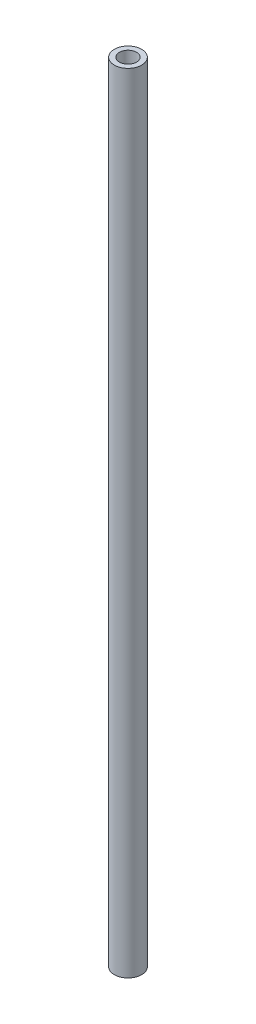
ISO-10303-21;
HEADER;
FILE_DESCRIPTION(('STEP AP214'),'2;1');
FILE_NAME('part.step','',(''),(''),'','','');
FILE_SCHEMA(('AUTOMOTIVE_DESIGN { 1 0 10303 214 1 1 1 1 }'));
ENDSEC;
DATA;
#1=APPLICATION_CONTEXT('core data for automotive mechanical design processes');
#2=APPLICATION_PROTOCOL_DEFINITION('international standard','automotive_design',2000,#1);
#3=PRODUCT_CONTEXT('',#1,'mechanical');
#4=PRODUCT('Part','Part','',(#3));
#5=PRODUCT_RELATED_PRODUCT_CATEGORY('part','',(#4));
#6=PRODUCT_DEFINITION_FORMATION('','',#4);
#7=PRODUCT_DEFINITION_CONTEXT('part definition',#1,'design');
#8=PRODUCT_DEFINITION('design','',#6,#7);
#9=PRODUCT_DEFINITION_SHAPE('','',#8);
#10=(LENGTH_UNIT() NAMED_UNIT(*) SI_UNIT(.MILLI.,.METRE.));
#11=(NAMED_UNIT(*) PLANE_ANGLE_UNIT() SI_UNIT($,.RADIAN.));
#12=(NAMED_UNIT(*) SI_UNIT($,.STERADIAN.) SOLID_ANGLE_UNIT());
#13=UNCERTAINTY_MEASURE_WITH_UNIT(LENGTH_MEASURE(1.E-05),#10,'distance_accuracy_value','');
#14=(GEOMETRIC_REPRESENTATION_CONTEXT(3) GLOBAL_UNCERTAINTY_ASSIGNED_CONTEXT((#13)) GLOBAL_UNIT_ASSIGNED_CONTEXT((#10,
#11,#12)) REPRESENTATION_CONTEXT('',''));
#15=CARTESIAN_POINT('',(0.,0.,0.));
#16=DIRECTION('',(0.,0.,1.));
#17=DIRECTION('',(1.,0.,0.));
#18=AXIS2_PLACEMENT_3D('',#15,#16,#17);
#19=CARTESIAN_POINT('',(0.,230.,0.));
#20=DIRECTION('',(0.,1.,0.));
#21=DIRECTION('',(0.,0.,1.));
#22=AXIS2_PLACEMENT_3D('',#19,#20,#21);
#23=PLANE('',#22);
#24=CARTESIAN_POINT('',(0.,230.,0.));
#25=DIRECTION('',(0.,1.,0.));
#26=DIRECTION('',(0.,0.,1.));
#27=AXIS2_PLACEMENT_3D('',#24,#25,#26);
#28=CIRCLE('',#27,4.);
#29=CARTESIAN_POINT('',(0.,230.,4.));
#30=VERTEX_POINT('',#29);
#31=EDGE_CURVE('E10',#30,#30,#28,.T.);
#32=ORIENTED_EDGE('',*,*,#31,.T.);
#33=EDGE_LOOP('',(#32));
#34=FACE_BOUND('',#33,.T.);
#35=CARTESIAN_POINT('',(0.,230.,0.));
#36=DIRECTION('',(0.,1.,0.));
#37=DIRECTION('',(0.,0.,1.));
#38=AXIS2_PLACEMENT_3D('',#35,#36,#37);
#39=CIRCLE('',#38,2.5);
#40=CARTESIAN_POINT('',(0.,230.,2.5));
#41=VERTEX_POINT('',#40);
#42=EDGE_CURVE('E52',#41,#41,#39,.T.);
#43=ORIENTED_EDGE('',*,*,#42,.F.);
#44=EDGE_LOOP('',(#43));
#45=FACE_BOUND('',#44,.T.);
#46=ADVANCED_FACE('F39',(#34,#45),#23,.T.);
#47=CARTESIAN_POINT('',(0.,0.,0.));
#48=DIRECTION('',(0.,1.,0.));
#49=DIRECTION('',(0.,0.,1.));
#50=AXIS2_PLACEMENT_3D('',#47,#48,#49);
#51=PLANE('',#50);
#52=CARTESIAN_POINT('',(0.,0.,0.));
#53=DIRECTION('',(0.,1.,0.));
#54=DIRECTION('',(0.,0.,1.));
#55=AXIS2_PLACEMENT_3D('',#52,#53,#54);
#56=CIRCLE('',#55,4.);
#57=CARTESIAN_POINT('',(0.,0.,4.));
#58=VERTEX_POINT('',#57);
#59=EDGE_CURVE('E43',#58,#58,#56,.T.);
#60=ORIENTED_EDGE('',*,*,#59,.F.);
#61=EDGE_LOOP('',(#60));
#62=FACE_BOUND('',#61,.T.);
#63=CARTESIAN_POINT('',(0.,0.,0.));
#64=DIRECTION('',(0.,1.,0.));
#65=DIRECTION('',(0.,0.,1.));
#66=AXIS2_PLACEMENT_3D('',#63,#64,#65);
#67=CIRCLE('',#66,2.5);
#68=CARTESIAN_POINT('',(0.,0.,2.5));
#69=VERTEX_POINT('',#68);
#70=EDGE_CURVE('E54',#69,#69,#67,.T.);
#71=ORIENTED_EDGE('',*,*,#70,.T.);
#72=EDGE_LOOP('',(#71));
#73=FACE_BOUND('',#72,.T.);
#74=ADVANCED_FACE('F66',(#62,#73),#51,.F.);
#75=CARTESIAN_POINT('',(0.,230.,0.));
#76=DIRECTION('',(0.,-1.,0.));
#77=DIRECTION('',(0.,0.,-1.));
#78=AXIS2_PLACEMENT_3D('',#75,#76,#77);
#79=CYLINDRICAL_SURFACE('',#78,4.);
#80=ORIENTED_EDGE('',*,*,#31,.F.);
#81=EDGE_LOOP('',(#80));
#82=FACE_BOUND('',#81,.T.);
#83=ORIENTED_EDGE('',*,*,#59,.T.);
#84=EDGE_LOOP('',(#83));
#85=FACE_BOUND('',#84,.T.);
#86=ADVANCED_FACE('F41',(#82,#85),#79,.T.);
#87=CARTESIAN_POINT('',(0.,230.,0.));
#88=DIRECTION('',(0.,-1.,0.));
#89=DIRECTION('',(0.,0.,-1.));
#90=AXIS2_PLACEMENT_3D('',#87,#88,#89);
#91=CYLINDRICAL_SURFACE('',#90,2.5);
#92=ORIENTED_EDGE('',*,*,#42,.T.);
#93=EDGE_LOOP('',(#92));
#94=FACE_BOUND('',#93,.T.);
#95=ORIENTED_EDGE('',*,*,#70,.F.);
#96=EDGE_LOOP('',(#95));
#97=FACE_BOUND('',#96,.T.);
#98=ADVANCED_FACE('F62',(#94,#97),#91,.F.);
#99=CLOSED_SHELL('',(#46,#74,#86,#98));
#100=MANIFOLD_SOLID_BREP('B2',#99);
#101=ADVANCED_BREP_SHAPE_REPRESENTATION('',(#18,#100),#14);
#102=SHAPE_DEFINITION_REPRESENTATION(#9,#101);
ENDSEC;
END-ISO-10303-21;
